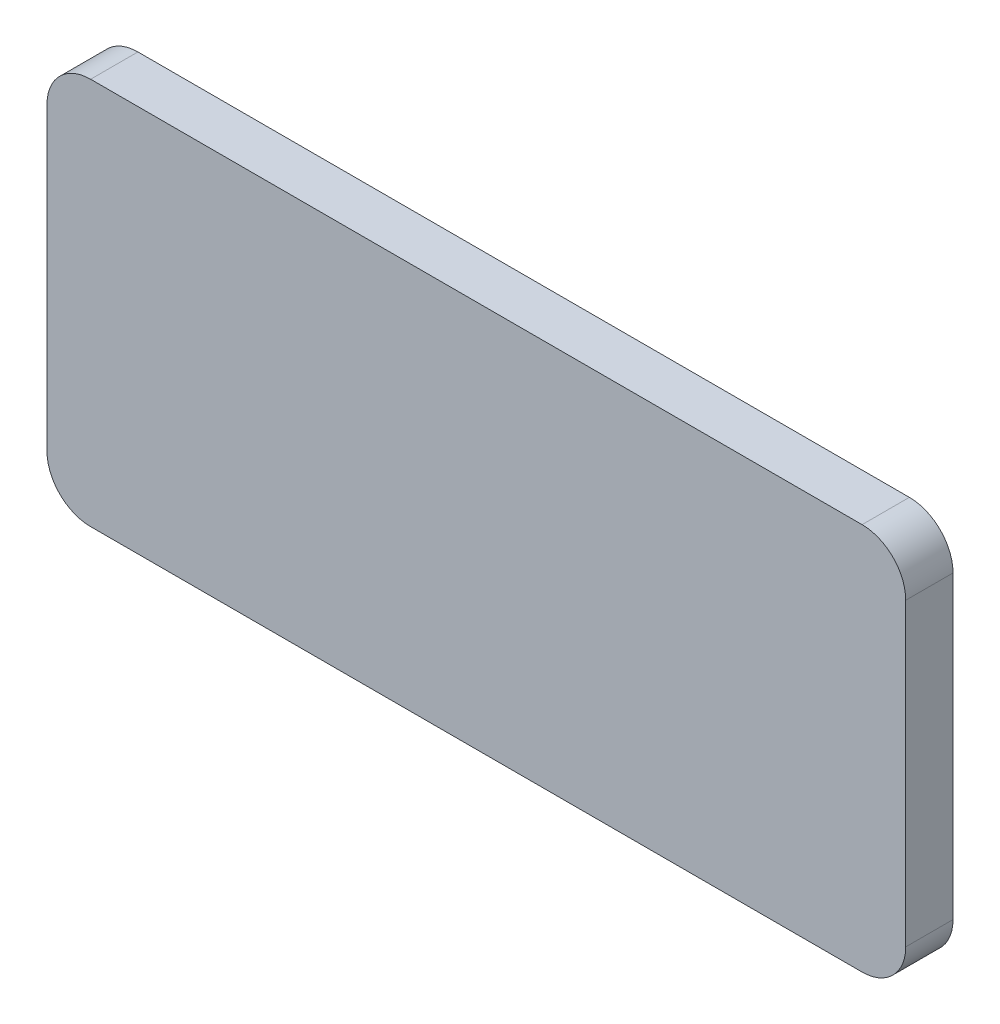
ISO-10303-21;
HEADER;
FILE_DESCRIPTION(('STEP AP214'),'2;1');
FILE_NAME('part.step','',(''),(''),'','','');
FILE_SCHEMA(('AUTOMOTIVE_DESIGN { 1 0 10303 214 1 1 1 1 }'));
ENDSEC;
DATA;
#1=APPLICATION_CONTEXT('core data for automotive mechanical design processes');
#2=APPLICATION_PROTOCOL_DEFINITION('international standard','automotive_design',2000,#1);
#3=PRODUCT_CONTEXT('',#1,'mechanical');
#4=PRODUCT('Part','Part','',(#3));
#5=PRODUCT_RELATED_PRODUCT_CATEGORY('part','',(#4));
#6=PRODUCT_DEFINITION_FORMATION('','',#4);
#7=PRODUCT_DEFINITION_CONTEXT('part definition',#1,'design');
#8=PRODUCT_DEFINITION('design','',#6,#7);
#9=PRODUCT_DEFINITION_SHAPE('','',#8);
#10=(LENGTH_UNIT() NAMED_UNIT(*) SI_UNIT(.MILLI.,.METRE.));
#11=(NAMED_UNIT(*) PLANE_ANGLE_UNIT() SI_UNIT($,.RADIAN.));
#12=(NAMED_UNIT(*) SI_UNIT($,.STERADIAN.) SOLID_ANGLE_UNIT());
#13=UNCERTAINTY_MEASURE_WITH_UNIT(LENGTH_MEASURE(1.E-05),#10,'distance_accuracy_value','');
#14=(GEOMETRIC_REPRESENTATION_CONTEXT(3) GLOBAL_UNCERTAINTY_ASSIGNED_CONTEXT((#13)) GLOBAL_UNIT_ASSIGNED_CONTEXT((#10,
#11,#12)) REPRESENTATION_CONTEXT('',''));
#15=CARTESIAN_POINT('',(0.,0.,0.));
#16=DIRECTION('',(0.,0.,1.));
#17=DIRECTION('',(1.,0.,0.));
#18=AXIS2_PLACEMENT_3D('',#15,#16,#17);
#19=CARTESIAN_POINT('',(-24.48,-9.5254561280235,3.));
#20=DIRECTION('',(0.,0.,-1.));
#21=DIRECTION('',(-1.,0.,0.));
#22=AXIS2_PLACEMENT_3D('',#19,#20,#21);
#23=CYLINDRICAL_SURFACE('',#22,2.77);
#24=CARTESIAN_POINT('',(-24.48,-9.5254561280235,0.));
#25=DIRECTION('',(0.,0.,1.));
#26=DIRECTION('',(-1.,0.,0.));
#27=AXIS2_PLACEMENT_3D('',#24,#25,#26);
#28=CIRCLE('',#27,2.77);
#29=CARTESIAN_POINT('',(-27.25,-9.52545612802348,0.));
#30=VERTEX_POINT('',#29);
#31=CARTESIAN_POINT('',(-24.48,-12.2954561280235,0.));
#32=VERTEX_POINT('',#31);
#33=EDGE_CURVE('E128',#30,#32,#28,.T.);
#34=ORIENTED_EDGE('',*,*,#33,.T.);
#35=DIRECTION('',(0.,0.,-1.));
#36=VECTOR('',#35,1.);
#37=CARTESIAN_POINT('',(-24.48,-12.2954561280235,3.));
#38=LINE('',#37,#36);
#39=CARTESIAN_POINT('',(-24.48,-12.2954561280235,3.));
#40=VERTEX_POINT('',#39);
#41=EDGE_CURVE('E11',#40,#32,#38,.T.);
#42=ORIENTED_EDGE('',*,*,#41,.F.);
#43=CARTESIAN_POINT('',(-24.48,-9.5254561280235,3.));
#44=DIRECTION('',(0.,0.,1.));
#45=DIRECTION('',(-1.,0.,0.));
#46=AXIS2_PLACEMENT_3D('',#43,#44,#45);
#47=CIRCLE('',#46,2.77);
#48=CARTESIAN_POINT('',(-27.25,-9.52545612802348,3.));
#49=VERTEX_POINT('',#48);
#50=EDGE_CURVE('E142',#49,#40,#47,.T.);
#51=ORIENTED_EDGE('',*,*,#50,.F.);
#52=DIRECTION('',(0.,0.,-1.));
#53=VECTOR('',#52,1.);
#54=CARTESIAN_POINT('',(-27.25,-9.52545612802348,3.));
#55=LINE('',#54,#53);
#56=EDGE_CURVE('E124',#49,#30,#55,.T.);
#57=ORIENTED_EDGE('',*,*,#56,.T.);
#58=EDGE_LOOP('',(#34,#42,#51,#57));
#59=FACE_BOUND('',#58,.T.);
#60=ADVANCED_FACE('F32',(#59),#23,.T.);
#61=CARTESIAN_POINT('',(-24.48,-12.2954561280235,3.));
#62=DIRECTION('',(0.,1.,0.));
#63=DIRECTION('',(0.,0.,1.));
#64=AXIS2_PLACEMENT_3D('',#61,#62,#63);
#65=PLANE('',#64);
#66=DIRECTION('',(1.,0.,0.));
#67=VECTOR('',#66,1.);
#68=CARTESIAN_POINT('',(-24.48,-12.2954561280235,0.));
#69=LINE('',#68,#67);
#70=CARTESIAN_POINT('',(24.48,-12.2954561280235,0.));
#71=VERTEX_POINT('',#70);
#72=EDGE_CURVE('E131',#32,#71,#69,.T.);
#73=ORIENTED_EDGE('',*,*,#72,.T.);
#74=DIRECTION('',(0.,0.,-1.));
#75=VECTOR('',#74,1.);
#76=CARTESIAN_POINT('',(24.48,-12.2954561280235,3.));
#77=LINE('',#76,#75);
#78=CARTESIAN_POINT('',(24.48,-12.2954561280235,3.));
#79=VERTEX_POINT('',#78);
#80=EDGE_CURVE('E40',#79,#71,#77,.T.);
#81=ORIENTED_EDGE('',*,*,#80,.F.);
#82=DIRECTION('',(1.,0.,0.));
#83=VECTOR('',#82,1.);
#84=CARTESIAN_POINT('',(-24.48,-12.2954561280235,3.));
#85=LINE('',#84,#83);
#86=EDGE_CURVE('E91',#40,#79,#85,.T.);
#87=ORIENTED_EDGE('',*,*,#86,.F.);
#88=ORIENTED_EDGE('',*,*,#41,.T.);
#89=EDGE_LOOP('',(#73,#81,#87,#88));
#90=FACE_BOUND('',#89,.T.);
#91=ADVANCED_FACE('F177',(#90),#65,.F.);
#92=CARTESIAN_POINT('',(24.48,-9.5254561280235,3.));
#93=DIRECTION('',(0.,0.,-1.));
#94=DIRECTION('',(-1.,0.,0.));
#95=AXIS2_PLACEMENT_3D('',#92,#93,#94);
#96=CYLINDRICAL_SURFACE('',#95,2.77);
#97=CARTESIAN_POINT('',(24.48,-9.5254561280235,0.));
#98=DIRECTION('',(0.,0.,1.));
#99=DIRECTION('',(1.,0.,0.));
#100=AXIS2_PLACEMENT_3D('',#97,#98,#99);
#101=CIRCLE('',#100,2.77);
#102=CARTESIAN_POINT('',(27.25,-9.5254561280235,0.));
#103=VERTEX_POINT('',#102);
#104=EDGE_CURVE('E133',#71,#103,#101,.T.);
#105=ORIENTED_EDGE('',*,*,#104,.T.);
#106=DIRECTION('',(0.,0.,-1.));
#107=VECTOR('',#106,1.);
#108=CARTESIAN_POINT('',(27.25,-9.5254561280235,3.));
#109=LINE('',#108,#107);
#110=CARTESIAN_POINT('',(27.25,-9.5254561280235,3.));
#111=VERTEX_POINT('',#110);
#112=EDGE_CURVE('E149',#111,#103,#109,.T.);
#113=ORIENTED_EDGE('',*,*,#112,.F.);
#114=CARTESIAN_POINT('',(24.48,-9.5254561280235,3.));
#115=DIRECTION('',(0.,0.,1.));
#116=DIRECTION('',(1.,0.,0.));
#117=AXIS2_PLACEMENT_3D('',#114,#115,#116);
#118=CIRCLE('',#117,2.77);
#119=EDGE_CURVE('E157',#79,#111,#118,.T.);
#120=ORIENTED_EDGE('',*,*,#119,.F.);
#121=ORIENTED_EDGE('',*,*,#80,.T.);
#122=EDGE_LOOP('',(#105,#113,#120,#121));
#123=FACE_BOUND('',#122,.T.);
#124=ADVANCED_FACE('F155',(#123),#96,.T.);
#125=CARTESIAN_POINT('',(27.25,-9.52545612802348,3.));
#126=DIRECTION('',(-1.,0.,0.));
#127=DIRECTION('',(0.,0.,1.));
#128=AXIS2_PLACEMENT_3D('',#125,#126,#127);
#129=PLANE('',#128);
#130=DIRECTION('',(0.,1.,0.));
#131=VECTOR('',#130,1.);
#132=CARTESIAN_POINT('',(27.25,-9.52545612802348,0.));
#133=LINE('',#132,#131);
#134=CARTESIAN_POINT('',(27.25,9.52545612802348,0.));
#135=VERTEX_POINT('',#134);
#136=EDGE_CURVE('E135',#103,#135,#133,.T.);
#137=ORIENTED_EDGE('',*,*,#136,.T.);
#138=DIRECTION('',(0.,0.,-1.));
#139=VECTOR('',#138,1.);
#140=CARTESIAN_POINT('',(27.25,9.52545612802348,3.));
#141=LINE('',#140,#139);
#142=CARTESIAN_POINT('',(27.25,9.52545612802348,3.));
#143=VERTEX_POINT('',#142);
#144=EDGE_CURVE('E146',#143,#135,#141,.T.);
#145=ORIENTED_EDGE('',*,*,#144,.F.);
#146=DIRECTION('',(0.,1.,0.));
#147=VECTOR('',#146,1.);
#148=CARTESIAN_POINT('',(27.25,-9.52545612802348,3.));
#149=LINE('',#148,#147);
#150=EDGE_CURVE('E169',#111,#143,#149,.T.);
#151=ORIENTED_EDGE('',*,*,#150,.F.);
#152=ORIENTED_EDGE('',*,*,#112,.T.);
#153=EDGE_LOOP('',(#137,#145,#151,#152));
#154=FACE_BOUND('',#153,.T.);
#155=ADVANCED_FACE('F165',(#154),#129,.F.);
#156=CARTESIAN_POINT('',(24.48,9.5254561280235,3.));
#157=DIRECTION('',(0.,0.,-1.));
#158=DIRECTION('',(-1.,0.,0.));
#159=AXIS2_PLACEMENT_3D('',#156,#157,#158);
#160=CYLINDRICAL_SURFACE('',#159,2.77);
#161=CARTESIAN_POINT('',(24.48,9.5254561280235,0.));
#162=DIRECTION('',(0.,0.,1.));
#163=DIRECTION('',(-1.,0.,0.));
#164=AXIS2_PLACEMENT_3D('',#161,#162,#163);
#165=CIRCLE('',#164,2.77);
#166=CARTESIAN_POINT('',(24.48,12.2954561280235,0.));
#167=VERTEX_POINT('',#166);
#168=EDGE_CURVE('E137',#135,#167,#165,.T.);
#169=ORIENTED_EDGE('',*,*,#168,.T.);
#170=DIRECTION('',(0.,0.,-1.));
#171=VECTOR('',#170,1.);
#172=CARTESIAN_POINT('',(24.48,12.2954561280235,3.));
#173=LINE('',#172,#171);
#174=CARTESIAN_POINT('',(24.48,12.2954561280235,3.));
#175=VERTEX_POINT('',#174);
#176=EDGE_CURVE('E119',#175,#167,#173,.T.);
#177=ORIENTED_EDGE('',*,*,#176,.F.);
#178=CARTESIAN_POINT('',(24.48,9.5254561280235,3.));
#179=DIRECTION('',(0.,0.,1.));
#180=DIRECTION('',(-1.,0.,0.));
#181=AXIS2_PLACEMENT_3D('',#178,#179,#180);
#182=CIRCLE('',#181,2.77);
#183=EDGE_CURVE('E110',#143,#175,#182,.T.);
#184=ORIENTED_EDGE('',*,*,#183,.F.);
#185=ORIENTED_EDGE('',*,*,#144,.T.);
#186=EDGE_LOOP('',(#169,#177,#184,#185));
#187=FACE_BOUND('',#186,.T.);
#188=ADVANCED_FACE('F168',(#187),#160,.T.);
#189=CARTESIAN_POINT('',(-24.48,12.2954561280235,3.));
#190=DIRECTION('',(0.,-1.,0.));
#191=DIRECTION('',(0.,0.,-1.));
#192=AXIS2_PLACEMENT_3D('',#189,#190,#191);
#193=PLANE('',#192);
#194=DIRECTION('',(-1.,0.,0.));
#195=VECTOR('',#194,1.);
#196=CARTESIAN_POINT('',(-24.48,12.2954561280235,0.));
#197=LINE('',#196,#195);
#198=CARTESIAN_POINT('',(-24.48,12.2954561280235,0.));
#199=VERTEX_POINT('',#198);
#200=EDGE_CURVE('E118',#167,#199,#197,.T.);
#201=ORIENTED_EDGE('',*,*,#200,.T.);
#202=DIRECTION('',(0.,0.,-1.));
#203=VECTOR('',#202,1.);
#204=CARTESIAN_POINT('',(-24.48,12.2954561280235,3.));
#205=LINE('',#204,#203);
#206=CARTESIAN_POINT('',(-24.48,12.2954561280235,3.));
#207=VERTEX_POINT('',#206);
#208=EDGE_CURVE('E115',#207,#199,#205,.T.);
#209=ORIENTED_EDGE('',*,*,#208,.F.);
#210=DIRECTION('',(-1.,0.,0.));
#211=VECTOR('',#210,1.);
#212=CARTESIAN_POINT('',(-24.48,12.2954561280235,3.));
#213=LINE('',#212,#211);
#214=EDGE_CURVE('E104',#175,#207,#213,.T.);
#215=ORIENTED_EDGE('',*,*,#214,.F.);
#216=ORIENTED_EDGE('',*,*,#176,.T.);
#217=EDGE_LOOP('',(#201,#209,#215,#216));
#218=FACE_BOUND('',#217,.T.);
#219=ADVANCED_FACE('F116',(#218),#193,.F.);
#220=CARTESIAN_POINT('',(-24.48,9.5254561280235,3.));
#221=DIRECTION('',(0.,0.,-1.));
#222=DIRECTION('',(-1.,0.,0.));
#223=AXIS2_PLACEMENT_3D('',#220,#221,#222);
#224=CYLINDRICAL_SURFACE('',#223,2.77);
#225=CARTESIAN_POINT('',(-24.48,9.5254561280235,0.));
#226=DIRECTION('',(0.,0.,1.));
#227=DIRECTION('',(-1.,0.,0.));
#228=AXIS2_PLACEMENT_3D('',#225,#226,#227);
#229=CIRCLE('',#228,2.77);
#230=CARTESIAN_POINT('',(-27.25,9.52545612802348,0.));
#231=VERTEX_POINT('',#230);
#232=EDGE_CURVE('E77',#199,#231,#229,.T.);
#233=ORIENTED_EDGE('',*,*,#232,.T.);
#234=DIRECTION('',(0.,0.,-1.));
#235=VECTOR('',#234,1.);
#236=CARTESIAN_POINT('',(-27.25,9.52545612802348,3.));
#237=LINE('',#236,#235);
#238=CARTESIAN_POINT('',(-27.25,9.52545612802348,3.));
#239=VERTEX_POINT('',#238);
#240=EDGE_CURVE('E120',#239,#231,#237,.T.);
#241=ORIENTED_EDGE('',*,*,#240,.F.);
#242=CARTESIAN_POINT('',(-24.48,9.5254561280235,3.));
#243=DIRECTION('',(0.,0.,1.));
#244=DIRECTION('',(-1.,0.,0.));
#245=AXIS2_PLACEMENT_3D('',#242,#243,#244);
#246=CIRCLE('',#245,2.77);
#247=EDGE_CURVE('E108',#207,#239,#246,.T.);
#248=ORIENTED_EDGE('',*,*,#247,.F.);
#249=ORIENTED_EDGE('',*,*,#208,.T.);
#250=EDGE_LOOP('',(#233,#241,#248,#249));
#251=FACE_BOUND('',#250,.T.);
#252=ADVANCED_FACE('F122',(#251),#224,.T.);
#253=CARTESIAN_POINT('',(-27.25,-9.52545612802348,3.));
#254=DIRECTION('',(1.,0.,0.));
#255=DIRECTION('',(0.,0.,-1.));
#256=AXIS2_PLACEMENT_3D('',#253,#254,#255);
#257=PLANE('',#256);
#258=DIRECTION('',(0.,-1.,0.));
#259=VECTOR('',#258,1.);
#260=CARTESIAN_POINT('',(-27.25,-9.52545612802348,0.));
#261=LINE('',#260,#259);
#262=EDGE_CURVE('E83',#231,#30,#261,.T.);
#263=ORIENTED_EDGE('',*,*,#262,.T.);
#264=ORIENTED_EDGE('',*,*,#56,.F.);
#265=DIRECTION('',(0.,-1.,0.));
#266=VECTOR('',#265,1.);
#267=CARTESIAN_POINT('',(-27.25,-9.52545612802348,3.));
#268=LINE('',#267,#266);
#269=EDGE_CURVE('E48',#239,#49,#268,.T.);
#270=ORIENTED_EDGE('',*,*,#269,.F.);
#271=ORIENTED_EDGE('',*,*,#240,.T.);
#272=EDGE_LOOP('',(#263,#264,#270,#271));
#273=FACE_BOUND('',#272,.T.);
#274=ADVANCED_FACE('F193',(#273),#257,.F.);
#275=CARTESIAN_POINT('',(-24.48,-9.5254561280235,3.));
#276=DIRECTION('',(0.,0.,-1.));
#277=DIRECTION('',(-1.,0.,0.));
#278=AXIS2_PLACEMENT_3D('',#275,#276,#277);
#279=PLANE('',#278);
#280=ORIENTED_EDGE('',*,*,#50,.T.);
#281=ORIENTED_EDGE('',*,*,#86,.T.);
#282=ORIENTED_EDGE('',*,*,#119,.T.);
#283=ORIENTED_EDGE('',*,*,#150,.T.);
#284=ORIENTED_EDGE('',*,*,#183,.T.);
#285=ORIENTED_EDGE('',*,*,#214,.T.);
#286=ORIENTED_EDGE('',*,*,#247,.T.);
#287=ORIENTED_EDGE('',*,*,#269,.T.);
#288=EDGE_LOOP('',(#280,#281,#282,#283,#284,#285,#286,#287));
#289=FACE_BOUND('',#288,.T.);
#290=ADVANCED_FACE('F106',(#289),#279,.F.);
#291=CARTESIAN_POINT('',(-24.48,-9.5254561280235,0.));
#292=DIRECTION('',(0.,0.,-1.));
#293=DIRECTION('',(-1.,0.,0.));
#294=AXIS2_PLACEMENT_3D('',#291,#292,#293);
#295=PLANE('',#294);
#296=ORIENTED_EDGE('',*,*,#33,.F.);
#297=ORIENTED_EDGE('',*,*,#262,.F.);
#298=ORIENTED_EDGE('',*,*,#232,.F.);
#299=ORIENTED_EDGE('',*,*,#200,.F.);
#300=ORIENTED_EDGE('',*,*,#168,.F.);
#301=ORIENTED_EDGE('',*,*,#136,.F.);
#302=ORIENTED_EDGE('',*,*,#104,.F.);
#303=ORIENTED_EDGE('',*,*,#72,.F.);
#304=EDGE_LOOP('',(#296,#297,#298,#299,#300,#301,#302,#303));
#305=FACE_BOUND('',#304,.T.);
#306=ADVANCED_FACE('F161',(#305),#295,.T.);
#307=CLOSED_SHELL('',(#60,#91,#124,#155,#188,#219,#252,#274,#290,#306));
#308=MANIFOLD_SOLID_BREP('B2',#307);
#309=ADVANCED_BREP_SHAPE_REPRESENTATION('',(#18,#308),#14);
#310=SHAPE_DEFINITION_REPRESENTATION(#9,#309);
ENDSEC;
END-ISO-10303-21;
